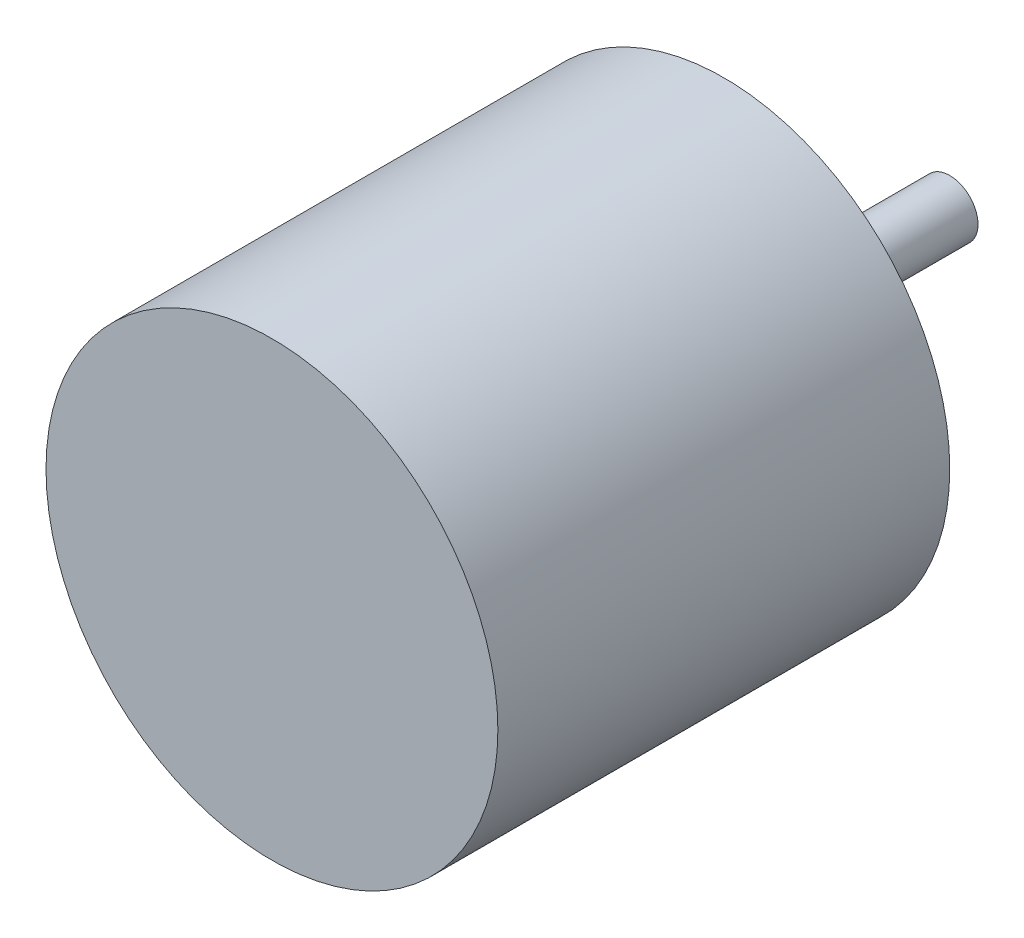
ISO-10303-21;
HEADER;
FILE_DESCRIPTION(('STEP AP214'),'2;1');
FILE_NAME('part.step','',(''),(''),'','','');
FILE_SCHEMA(('AUTOMOTIVE_DESIGN { 1 0 10303 214 1 1 1 1 }'));
ENDSEC;
DATA;
#1=APPLICATION_CONTEXT('core data for automotive mechanical design processes');
#2=APPLICATION_PROTOCOL_DEFINITION('international standard','automotive_design',2000,#1);
#3=PRODUCT_CONTEXT('',#1,'mechanical');
#4=PRODUCT('Part','Part','',(#3));
#5=PRODUCT_RELATED_PRODUCT_CATEGORY('part','',(#4));
#6=PRODUCT_DEFINITION_FORMATION('','',#4);
#7=PRODUCT_DEFINITION_CONTEXT('part definition',#1,'design');
#8=PRODUCT_DEFINITION('design','',#6,#7);
#9=PRODUCT_DEFINITION_SHAPE('','',#8);
#10=(LENGTH_UNIT() NAMED_UNIT(*) SI_UNIT(.MILLI.,.METRE.));
#11=(NAMED_UNIT(*) PLANE_ANGLE_UNIT() SI_UNIT($,.RADIAN.));
#12=(NAMED_UNIT(*) SI_UNIT($,.STERADIAN.) SOLID_ANGLE_UNIT());
#13=UNCERTAINTY_MEASURE_WITH_UNIT(LENGTH_MEASURE(1.E-05),#10,'distance_accuracy_value','');
#14=(GEOMETRIC_REPRESENTATION_CONTEXT(3) GLOBAL_UNCERTAINTY_ASSIGNED_CONTEXT((#13)) GLOBAL_UNIT_ASSIGNED_CONTEXT((#10,
#11,#12)) REPRESENTATION_CONTEXT('',''));
#15=CARTESIAN_POINT('',(0.,0.,0.));
#16=DIRECTION('',(0.,0.,1.));
#17=DIRECTION('',(1.,0.,0.));
#18=AXIS2_PLACEMENT_3D('',#15,#16,#17);
#19=CARTESIAN_POINT('',(0.,0.,-60.));
#20=DIRECTION('',(0.,0.,1.));
#21=DIRECTION('',(1.,0.,0.));
#22=AXIS2_PLACEMENT_3D('',#19,#20,#21);
#23=PLANE('',#22);
#24=CARTESIAN_POINT('',(0.,0.,-60.));
#25=DIRECTION('',(0.,0.,1.));
#26=DIRECTION('',(1.,0.,0.));
#27=AXIS2_PLACEMENT_3D('',#24,#25,#26);
#28=CIRCLE('',#27,2.5);
#29=CARTESIAN_POINT('',(2.5,0.,-60.));
#30=VERTEX_POINT('',#29);
#31=EDGE_CURVE('E10',#30,#30,#28,.T.);
#32=ORIENTED_EDGE('',*,*,#31,.F.);
#33=EDGE_LOOP('',(#32));
#34=FACE_BOUND('',#33,.T.);
#35=ADVANCED_FACE('F37',(#34),#23,.F.);
#36=CARTESIAN_POINT('',(0.,0.,0.));
#37=DIRECTION('',(0.,0.,1.));
#38=DIRECTION('',(1.,0.,0.));
#39=AXIS2_PLACEMENT_3D('',#36,#37,#38);
#40=CYLINDRICAL_SURFACE('',#39,2.5);
#41=CARTESIAN_POINT('',(0.,0.,-45.));
#42=DIRECTION('',(0.,0.,1.));
#43=DIRECTION('',(1.,0.,0.));
#44=AXIS2_PLACEMENT_3D('',#41,#42,#43);
#45=CIRCLE('',#44,2.5);
#46=CARTESIAN_POINT('',(2.5,0.,-45.));
#47=VERTEX_POINT('',#46);
#48=EDGE_CURVE('E44',#47,#47,#45,.T.);
#49=ORIENTED_EDGE('',*,*,#48,.F.);
#50=EDGE_LOOP('',(#49));
#51=FACE_BOUND('',#50,.T.);
#52=ORIENTED_EDGE('',*,*,#31,.T.);
#53=EDGE_LOOP('',(#52));
#54=FACE_BOUND('',#53,.T.);
#55=ADVANCED_FACE('F91',(#51,#54),#40,.T.);
#56=CARTESIAN_POINT('',(-2.5,0.,-45.));
#57=DIRECTION('',(0.,0.,1.));
#58=DIRECTION('',(1.,0.,0.));
#59=AXIS2_PLACEMENT_3D('',#56,#57,#58);
#60=PLANE('',#59);
#61=CARTESIAN_POINT('',(0.,0.,-45.));
#62=DIRECTION('',(0.,0.,1.));
#63=DIRECTION('',(1.,0.,0.));
#64=AXIS2_PLACEMENT_3D('',#61,#62,#63);
#65=CIRCLE('',#64,10.);
#66=CARTESIAN_POINT('',(10.,0.,-45.));
#67=VERTEX_POINT('',#66);
#68=EDGE_CURVE('E49',#67,#67,#65,.T.);
#69=ORIENTED_EDGE('',*,*,#68,.F.);
#70=EDGE_LOOP('',(#69));
#71=FACE_BOUND('',#70,.T.);
#72=ORIENTED_EDGE('',*,*,#48,.T.);
#73=EDGE_LOOP('',(#72));
#74=FACE_BOUND('',#73,.T.);
#75=ADVANCED_FACE('F86',(#71,#74),#60,.F.);
#76=CARTESIAN_POINT('',(0.,0.,0.));
#77=DIRECTION('',(0.,0.,1.));
#78=DIRECTION('',(1.,0.,0.));
#79=AXIS2_PLACEMENT_3D('',#76,#77,#78);
#80=CYLINDRICAL_SURFACE('',#79,10.);
#81=CARTESIAN_POINT('',(0.,0.,-40.));
#82=DIRECTION('',(0.,0.,1.));
#83=DIRECTION('',(1.,0.,0.));
#84=AXIS2_PLACEMENT_3D('',#81,#82,#83);
#85=CIRCLE('',#84,10.);
#86=CARTESIAN_POINT('',(10.,0.,-40.));
#87=VERTEX_POINT('',#86);
#88=EDGE_CURVE('E54',#87,#87,#85,.T.);
#89=ORIENTED_EDGE('',*,*,#88,.F.);
#90=EDGE_LOOP('',(#89));
#91=FACE_BOUND('',#90,.T.);
#92=ORIENTED_EDGE('',*,*,#68,.T.);
#93=EDGE_LOOP('',(#92));
#94=FACE_BOUND('',#93,.T.);
#95=ADVANCED_FACE('F80',(#91,#94),#80,.T.);
#96=CARTESIAN_POINT('',(-10.,0.,-40.));
#97=DIRECTION('',(0.,0.,1.));
#98=DIRECTION('',(1.,0.,0.));
#99=AXIS2_PLACEMENT_3D('',#96,#97,#98);
#100=PLANE('',#99);
#101=CARTESIAN_POINT('',(0.,0.,-40.));
#102=DIRECTION('',(0.,0.,1.));
#103=DIRECTION('',(1.,0.,0.));
#104=AXIS2_PLACEMENT_3D('',#101,#102,#103);
#105=CIRCLE('',#104,20.);
#106=CARTESIAN_POINT('',(20.,0.,-40.));
#107=VERTEX_POINT('',#106);
#108=EDGE_CURVE('E60',#107,#107,#105,.T.);
#109=ORIENTED_EDGE('',*,*,#108,.F.);
#110=EDGE_LOOP('',(#109));
#111=FACE_BOUND('',#110,.T.);
#112=ORIENTED_EDGE('',*,*,#88,.T.);
#113=EDGE_LOOP('',(#112));
#114=FACE_BOUND('',#113,.T.);
#115=ADVANCED_FACE('F74',(#111,#114),#100,.F.);
#116=CARTESIAN_POINT('',(0.,0.,0.));
#117=DIRECTION('',(0.,0.,1.));
#118=DIRECTION('',(1.,0.,0.));
#119=AXIS2_PLACEMENT_3D('',#116,#117,#118);
#120=CYLINDRICAL_SURFACE('',#119,20.);
#121=CARTESIAN_POINT('',(0.,0.,0.));
#122=DIRECTION('',(0.,0.,1.));
#123=DIRECTION('',(1.,0.,0.));
#124=AXIS2_PLACEMENT_3D('',#121,#122,#123);
#125=CIRCLE('',#124,20.);
#126=CARTESIAN_POINT('',(20.,0.,0.));
#127=VERTEX_POINT('',#126);
#128=EDGE_CURVE('E64',#127,#127,#125,.T.);
#129=ORIENTED_EDGE('',*,*,#128,.F.);
#130=EDGE_LOOP('',(#129));
#131=FACE_BOUND('',#130,.T.);
#132=ORIENTED_EDGE('',*,*,#108,.T.);
#133=EDGE_LOOP('',(#132));
#134=FACE_BOUND('',#133,.T.);
#135=ADVANCED_FACE('F71',(#131,#134),#120,.T.);
#136=CARTESIAN_POINT('',(-20.,0.,0.));
#137=DIRECTION('',(0.,0.,-1.));
#138=DIRECTION('',(-1.,0.,0.));
#139=AXIS2_PLACEMENT_3D('',#136,#137,#138);
#140=PLANE('',#139);
#141=ORIENTED_EDGE('',*,*,#128,.T.);
#142=EDGE_LOOP('',(#141));
#143=FACE_BOUND('',#142,.T.);
#144=ADVANCED_FACE('F69',(#143),#140,.F.);
#145=CLOSED_SHELL('',(#35,#55,#75,#95,#115,#135,#144));
#146=MANIFOLD_SOLID_BREP('B2',#145);
#147=ADVANCED_BREP_SHAPE_REPRESENTATION('',(#18,#146),#14);
#148=SHAPE_DEFINITION_REPRESENTATION(#9,#147);
ENDSEC;
END-ISO-10303-21;
